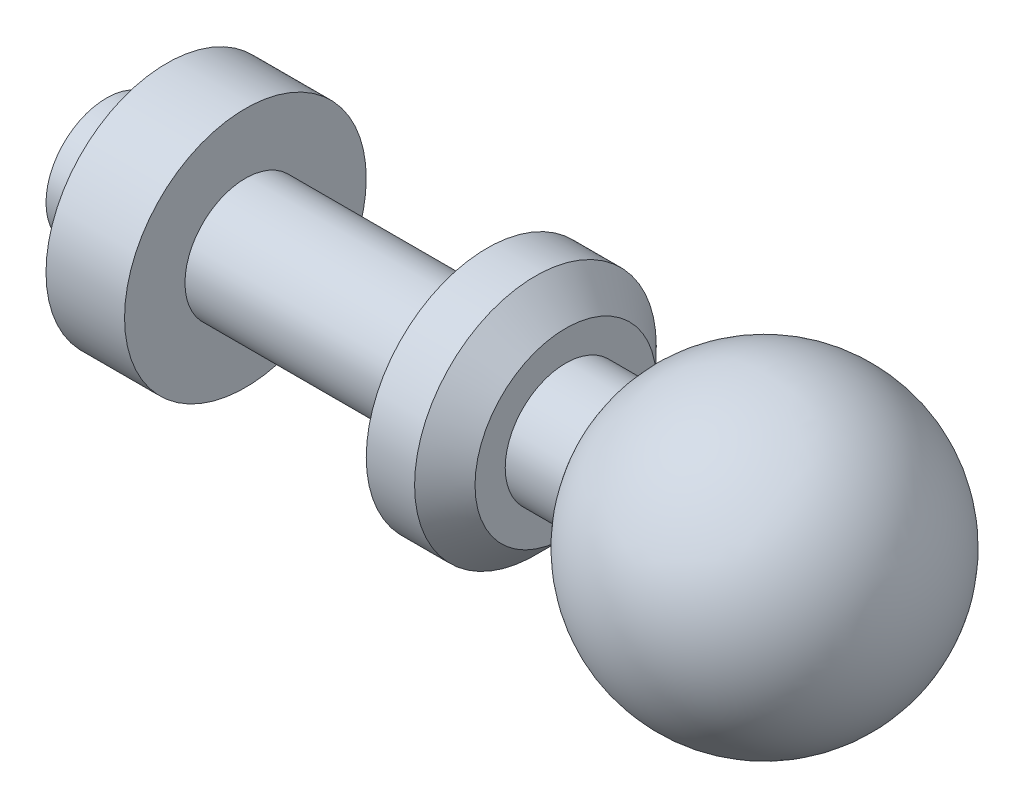
ISO-10303-21;
HEADER;
FILE_DESCRIPTION(('STEP AP214'),'2;1');
FILE_NAME('part.step','',(''),(''),'','','');
FILE_SCHEMA(('AUTOMOTIVE_DESIGN { 1 0 10303 214 1 1 1 1 }'));
ENDSEC;
DATA;
#1=APPLICATION_CONTEXT('core data for automotive mechanical design processes');
#2=APPLICATION_PROTOCOL_DEFINITION('international standard','automotive_design',2000,#1);
#3=PRODUCT_CONTEXT('',#1,'mechanical');
#4=PRODUCT('Part','Part','',(#3));
#5=PRODUCT_RELATED_PRODUCT_CATEGORY('part','',(#4));
#6=PRODUCT_DEFINITION_FORMATION('','',#4);
#7=PRODUCT_DEFINITION_CONTEXT('part definition',#1,'design');
#8=PRODUCT_DEFINITION('design','',#6,#7);
#9=PRODUCT_DEFINITION_SHAPE('','',#8);
#10=(LENGTH_UNIT() NAMED_UNIT(*) SI_UNIT(.MILLI.,.METRE.));
#11=(NAMED_UNIT(*) PLANE_ANGLE_UNIT() SI_UNIT($,.RADIAN.));
#12=(NAMED_UNIT(*) SI_UNIT($,.STERADIAN.) SOLID_ANGLE_UNIT());
#13=UNCERTAINTY_MEASURE_WITH_UNIT(LENGTH_MEASURE(1.E-05),#10,'distance_accuracy_value','');
#14=(GEOMETRIC_REPRESENTATION_CONTEXT(3) GLOBAL_UNCERTAINTY_ASSIGNED_CONTEXT((#13)) GLOBAL_UNIT_ASSIGNED_CONTEXT((#10,
#11,#12)) REPRESENTATION_CONTEXT('',''));
#15=CARTESIAN_POINT('',(0.,0.,0.));
#16=DIRECTION('',(0.,0.,1.));
#17=DIRECTION('',(1.,0.,0.));
#18=AXIS2_PLACEMENT_3D('',#15,#16,#17);
#19=CARTESIAN_POINT('',(108.912878474779,0.,0.));
#20=DIRECTION('',(-1.,0.,0.));
#21=DIRECTION('',(0.,1.,0.));
#22=AXIS2_PLACEMENT_3D('',#19,#20,#21);
#23=SPHERICAL_SURFACE('',#22,25.);
#24=CARTESIAN_POINT('',(86.,0.,0.));
#25=DIRECTION('',(-1.,0.,0.));
#26=DIRECTION('',(0.,0.,1.));
#27=AXIS2_PLACEMENT_3D('',#24,#25,#26);
#28=CIRCLE('',#27,10.);
#29=CARTESIAN_POINT('',(86.,0.,10.));
#30=VERTEX_POINT('',#29);
#31=EDGE_CURVE('E10',#30,#30,#28,.T.);
#32=ORIENTED_EDGE('',*,*,#31,.F.);
#33=EDGE_LOOP('',(#32));
#34=FACE_BOUND('',#33,.T.);
#35=ADVANCED_FACE('F31',(#34),#23,.T.);
#36=CARTESIAN_POINT('',(0.,0.,0.));
#37=DIRECTION('',(-1.,0.,0.));
#38=DIRECTION('',(0.,0.,1.));
#39=AXIS2_PLACEMENT_3D('',#36,#37,#38);
#40=CYLINDRICAL_SURFACE('',#39,10.);
#41=CARTESIAN_POINT('',(76.,0.,0.));
#42=DIRECTION('',(-1.,0.,0.));
#43=DIRECTION('',(0.,0.,1.));
#44=AXIS2_PLACEMENT_3D('',#41,#42,#43);
#45=CIRCLE('',#44,10.);
#46=CARTESIAN_POINT('',(76.,0.,10.));
#47=VERTEX_POINT('',#46);
#48=EDGE_CURVE('E37',#47,#47,#45,.T.);
#49=ORIENTED_EDGE('',*,*,#48,.F.);
#50=EDGE_LOOP('',(#49));
#51=FACE_BOUND('',#50,.T.);
#52=ORIENTED_EDGE('',*,*,#31,.T.);
#53=EDGE_LOOP('',(#52));
#54=FACE_BOUND('',#53,.T.);
#55=ADVANCED_FACE('F124',(#51,#54),#40,.T.);
#56=CARTESIAN_POINT('',(76.,15.,0.));
#57=DIRECTION('',(-1.,0.,0.));
#58=DIRECTION('',(0.,0.,1.));
#59=AXIS2_PLACEMENT_3D('',#56,#57,#58);
#60=PLANE('',#59);
#61=CARTESIAN_POINT('',(76.,0.,0.));
#62=DIRECTION('',(-1.,0.,0.));
#63=DIRECTION('',(0.,0.,1.));
#64=AXIS2_PLACEMENT_3D('',#61,#62,#63);
#65=CIRCLE('',#64,15.);
#66=CARTESIAN_POINT('',(76.,0.,15.));
#67=VERTEX_POINT('',#66);
#68=EDGE_CURVE('E41',#67,#67,#65,.T.);
#69=ORIENTED_EDGE('',*,*,#68,.F.);
#70=EDGE_LOOP('',(#69));
#71=FACE_BOUND('',#70,.T.);
#72=ORIENTED_EDGE('',*,*,#48,.T.);
#73=EDGE_LOOP('',(#72));
#74=FACE_BOUND('',#73,.T.);
#75=ADVANCED_FACE('F119',(#71,#74),#60,.F.);
#76=CARTESIAN_POINT('',(76.,0.,0.));
#77=DIRECTION('',(-1.,0.,0.));
#78=DIRECTION('',(0.,0.,1.));
#79=AXIS2_PLACEMENT_3D('',#76,#77,#78);
#80=CONICAL_SURFACE('',#79,15.,0.785398163397449);
#81=CARTESIAN_POINT('',(71.,0.,0.));
#82=DIRECTION('',(-1.,0.,0.));
#83=DIRECTION('',(0.,0.,1.));
#84=AXIS2_PLACEMENT_3D('',#81,#82,#83);
#85=CIRCLE('',#84,20.);
#86=CARTESIAN_POINT('',(71.,0.,20.));
#87=VERTEX_POINT('',#86);
#88=EDGE_CURVE('E45',#87,#87,#85,.T.);
#89=ORIENTED_EDGE('',*,*,#88,.F.);
#90=EDGE_LOOP('',(#89));
#91=FACE_BOUND('',#90,.T.);
#92=ORIENTED_EDGE('',*,*,#68,.T.);
#93=EDGE_LOOP('',(#92));
#94=FACE_BOUND('',#93,.T.);
#95=ADVANCED_FACE('F113',(#91,#94),#80,.T.);
#96=CARTESIAN_POINT('',(0.,0.,0.));
#97=DIRECTION('',(-1.,0.,0.));
#98=DIRECTION('',(0.,0.,1.));
#99=AXIS2_PLACEMENT_3D('',#96,#97,#98);
#100=CYLINDRICAL_SURFACE('',#99,20.);
#101=CARTESIAN_POINT('',(63.,0.,0.));
#102=DIRECTION('',(-1.,0.,0.));
#103=DIRECTION('',(0.,0.,1.));
#104=AXIS2_PLACEMENT_3D('',#101,#102,#103);
#105=CIRCLE('',#104,20.);
#106=CARTESIAN_POINT('',(63.,0.,20.));
#107=VERTEX_POINT('',#106);
#108=EDGE_CURVE('E50',#107,#107,#105,.T.);
#109=ORIENTED_EDGE('',*,*,#108,.F.);
#110=EDGE_LOOP('',(#109));
#111=FACE_BOUND('',#110,.T.);
#112=ORIENTED_EDGE('',*,*,#88,.T.);
#113=EDGE_LOOP('',(#112));
#114=FACE_BOUND('',#113,.T.);
#115=ADVANCED_FACE('F107',(#111,#114),#100,.T.);
#116=CARTESIAN_POINT('',(63.,10.,0.));
#117=DIRECTION('',(1.,0.,0.));
#118=DIRECTION('',(0.,0.,-1.));
#119=AXIS2_PLACEMENT_3D('',#116,#117,#118);
#120=PLANE('',#119);
#121=CARTESIAN_POINT('',(63.,0.,0.));
#122=DIRECTION('',(-1.,0.,0.));
#123=DIRECTION('',(0.,0.,1.));
#124=AXIS2_PLACEMENT_3D('',#121,#122,#123);
#125=CIRCLE('',#124,10.);
#126=CARTESIAN_POINT('',(63.,0.,10.));
#127=VERTEX_POINT('',#126);
#128=EDGE_CURVE('E53',#127,#127,#125,.T.);
#129=ORIENTED_EDGE('',*,*,#128,.F.);
#130=EDGE_LOOP('',(#129));
#131=FACE_BOUND('',#130,.T.);
#132=ORIENTED_EDGE('',*,*,#108,.T.);
#133=EDGE_LOOP('',(#132));
#134=FACE_BOUND('',#133,.T.);
#135=ADVANCED_FACE('F101',(#131,#134),#120,.F.);
#136=CARTESIAN_POINT('',(0.,0.,0.));
#137=DIRECTION('',(-1.,0.,0.));
#138=DIRECTION('',(0.,0.,1.));
#139=AXIS2_PLACEMENT_3D('',#136,#137,#138);
#140=CYLINDRICAL_SURFACE('',#139,10.);
#141=CARTESIAN_POINT('',(23.,0.,0.));
#142=DIRECTION('',(-1.,0.,0.));
#143=DIRECTION('',(0.,0.,1.));
#144=AXIS2_PLACEMENT_3D('',#141,#142,#143);
#145=CIRCLE('',#144,10.);
#146=CARTESIAN_POINT('',(23.,0.,10.));
#147=VERTEX_POINT('',#146);
#148=EDGE_CURVE('E56',#147,#147,#145,.T.);
#149=ORIENTED_EDGE('',*,*,#148,.F.);
#150=EDGE_LOOP('',(#149));
#151=FACE_BOUND('',#150,.T.);
#152=ORIENTED_EDGE('',*,*,#128,.T.);
#153=EDGE_LOOP('',(#152));
#154=FACE_BOUND('',#153,.T.);
#155=ADVANCED_FACE('F95',(#151,#154),#140,.T.);
#156=CARTESIAN_POINT('',(23.,20.,0.));
#157=DIRECTION('',(-1.,0.,0.));
#158=DIRECTION('',(0.,0.,1.));
#159=AXIS2_PLACEMENT_3D('',#156,#157,#158);
#160=PLANE('',#159);
#161=CARTESIAN_POINT('',(23.,0.,0.));
#162=DIRECTION('',(-1.,0.,0.));
#163=DIRECTION('',(0.,0.,1.));
#164=AXIS2_PLACEMENT_3D('',#161,#162,#163);
#165=CIRCLE('',#164,20.);
#166=CARTESIAN_POINT('',(23.,0.,20.));
#167=VERTEX_POINT('',#166);
#168=EDGE_CURVE('E59',#167,#167,#165,.T.);
#169=ORIENTED_EDGE('',*,*,#168,.F.);
#170=EDGE_LOOP('',(#169));
#171=FACE_BOUND('',#170,.T.);
#172=ORIENTED_EDGE('',*,*,#148,.T.);
#173=EDGE_LOOP('',(#172));
#174=FACE_BOUND('',#173,.T.);
#175=ADVANCED_FACE('F89',(#171,#174),#160,.F.);
#176=CARTESIAN_POINT('',(0.,0.,0.));
#177=DIRECTION('',(-1.,0.,0.));
#178=DIRECTION('',(0.,0.,1.));
#179=AXIS2_PLACEMENT_3D('',#176,#177,#178);
#180=CYLINDRICAL_SURFACE('',#179,20.);
#181=CARTESIAN_POINT('',(10.,0.,0.));
#182=DIRECTION('',(-1.,0.,0.));
#183=DIRECTION('',(0.,0.,1.));
#184=AXIS2_PLACEMENT_3D('',#181,#182,#183);
#185=CIRCLE('',#184,20.);
#186=CARTESIAN_POINT('',(10.,0.,20.));
#187=VERTEX_POINT('',#186);
#188=EDGE_CURVE('E62',#187,#187,#185,.T.);
#189=ORIENTED_EDGE('',*,*,#188,.F.);
#190=EDGE_LOOP('',(#189));
#191=FACE_BOUND('',#190,.T.);
#192=ORIENTED_EDGE('',*,*,#168,.T.);
#193=EDGE_LOOP('',(#192));
#194=FACE_BOUND('',#193,.T.);
#195=ADVANCED_FACE('F83',(#191,#194),#180,.T.);
#196=CARTESIAN_POINT('',(10.,10.,0.));
#197=DIRECTION('',(1.,0.,0.));
#198=DIRECTION('',(0.,0.,-1.));
#199=AXIS2_PLACEMENT_3D('',#196,#197,#198);
#200=PLANE('',#199);
#201=CARTESIAN_POINT('',(10.,0.,0.));
#202=DIRECTION('',(-1.,0.,0.));
#203=DIRECTION('',(0.,0.,1.));
#204=AXIS2_PLACEMENT_3D('',#201,#202,#203);
#205=CIRCLE('',#204,10.);
#206=CARTESIAN_POINT('',(10.,0.,10.));
#207=VERTEX_POINT('',#206);
#208=EDGE_CURVE('E65',#207,#207,#205,.T.);
#209=ORIENTED_EDGE('',*,*,#208,.F.);
#210=EDGE_LOOP('',(#209));
#211=FACE_BOUND('',#210,.T.);
#212=ORIENTED_EDGE('',*,*,#188,.T.);
#213=EDGE_LOOP('',(#212));
#214=FACE_BOUND('',#213,.T.);
#215=ADVANCED_FACE('F77',(#211,#214),#200,.F.);
#216=CARTESIAN_POINT('',(0.,0.,0.));
#217=DIRECTION('',(-1.,0.,0.));
#218=DIRECTION('',(0.,0.,1.));
#219=AXIS2_PLACEMENT_3D('',#216,#217,#218);
#220=CYLINDRICAL_SURFACE('',#219,10.);
#221=CARTESIAN_POINT('',(0.,0.,0.));
#222=DIRECTION('',(-1.,0.,0.));
#223=DIRECTION('',(0.,0.,1.));
#224=AXIS2_PLACEMENT_3D('',#221,#222,#223);
#225=CIRCLE('',#224,10.);
#226=CARTESIAN_POINT('',(0.,0.,10.));
#227=VERTEX_POINT('',#226);
#228=EDGE_CURVE('E68',#227,#227,#225,.T.);
#229=ORIENTED_EDGE('',*,*,#228,.F.);
#230=EDGE_LOOP('',(#229));
#231=FACE_BOUND('',#230,.T.);
#232=ORIENTED_EDGE('',*,*,#208,.T.);
#233=EDGE_LOOP('',(#232));
#234=FACE_BOUND('',#233,.T.);
#235=ADVANCED_FACE('F74',(#231,#234),#220,.T.);
#236=CARTESIAN_POINT('',(0.,0.,0.));
#237=DIRECTION('',(1.,0.,0.));
#238=DIRECTION('',(0.,0.,-1.));
#239=AXIS2_PLACEMENT_3D('',#236,#237,#238);
#240=PLANE('',#239);
#241=ORIENTED_EDGE('',*,*,#228,.T.);
#242=EDGE_LOOP('',(#241));
#243=FACE_BOUND('',#242,.T.);
#244=ADVANCED_FACE('F72',(#243),#240,.F.);
#245=CLOSED_SHELL('',(#35,#55,#75,#95,#115,#135,#155,#175,#195,#215,#235,#244));
#246=MANIFOLD_SOLID_BREP('B2',#245);
#247=ADVANCED_BREP_SHAPE_REPRESENTATION('',(#18,#246),#14);
#248=SHAPE_DEFINITION_REPRESENTATION(#9,#247);
ENDSEC;
END-ISO-10303-21;
